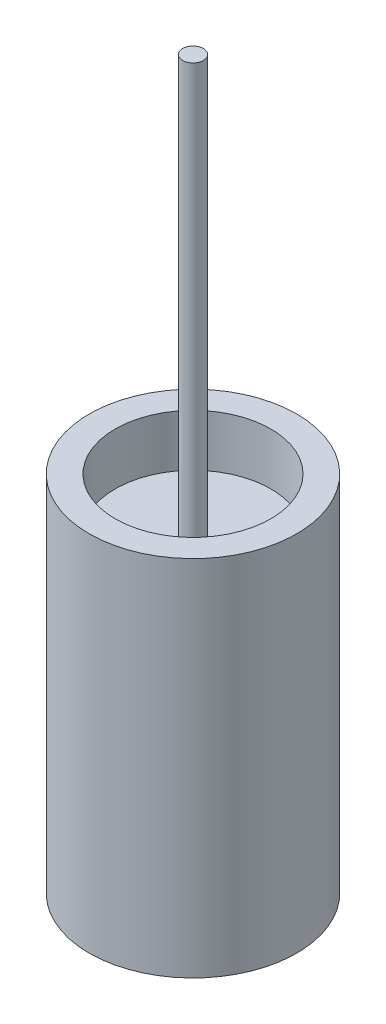
ISO-10303-21;
HEADER;
FILE_DESCRIPTION(('STEP AP214'),'2;1');
FILE_NAME('part.step','',(''),(''),'','','');
FILE_SCHEMA(('AUTOMOTIVE_DESIGN { 1 0 10303 214 1 1 1 1 }'));
ENDSEC;
DATA;
#1=APPLICATION_CONTEXT('core data for automotive mechanical design processes');
#2=APPLICATION_PROTOCOL_DEFINITION('international standard','automotive_design',2000,#1);
#3=PRODUCT_CONTEXT('',#1,'mechanical');
#4=PRODUCT('Part','Part','',(#3));
#5=PRODUCT_RELATED_PRODUCT_CATEGORY('part','',(#4));
#6=PRODUCT_DEFINITION_FORMATION('','',#4);
#7=PRODUCT_DEFINITION_CONTEXT('part definition',#1,'design');
#8=PRODUCT_DEFINITION('design','',#6,#7);
#9=PRODUCT_DEFINITION_SHAPE('','',#8);
#10=(LENGTH_UNIT() NAMED_UNIT(*) SI_UNIT(.MILLI.,.METRE.));
#11=(NAMED_UNIT(*) PLANE_ANGLE_UNIT() SI_UNIT($,.RADIAN.));
#12=(NAMED_UNIT(*) SI_UNIT($,.STERADIAN.) SOLID_ANGLE_UNIT());
#13=UNCERTAINTY_MEASURE_WITH_UNIT(LENGTH_MEASURE(1.E-05),#10,'distance_accuracy_value','');
#14=(GEOMETRIC_REPRESENTATION_CONTEXT(3) GLOBAL_UNCERTAINTY_ASSIGNED_CONTEXT((#13)) GLOBAL_UNIT_ASSIGNED_CONTEXT((#10,
#11,#12)) REPRESENTATION_CONTEXT('',''));
#15=CARTESIAN_POINT('',(0.,0.,0.));
#16=DIRECTION('',(0.,0.,1.));
#17=DIRECTION('',(1.,0.,0.));
#18=AXIS2_PLACEMENT_3D('',#15,#16,#17);
#19=CARTESIAN_POINT('',(0.,35.,0.));
#20=DIRECTION('',(0.,-1.,0.));
#21=DIRECTION('',(0.,0.,-1.));
#22=AXIS2_PLACEMENT_3D('',#19,#20,#21);
#23=CYLINDRICAL_SURFACE('',#22,10.);
#24=CARTESIAN_POINT('',(0.,35.,0.));
#25=DIRECTION('',(0.,1.,0.));
#26=DIRECTION('',(0.,0.,1.));
#27=AXIS2_PLACEMENT_3D('',#24,#25,#26);
#28=CIRCLE('',#27,10.);
#29=CARTESIAN_POINT('',(0.,35.,10.));
#30=VERTEX_POINT('',#29);
#31=EDGE_CURVE('E10',#30,#30,#28,.T.);
#32=ORIENTED_EDGE('',*,*,#31,.F.);
#33=EDGE_LOOP('',(#32));
#34=FACE_BOUND('',#33,.T.);
#35=CARTESIAN_POINT('',(0.,0.,0.));
#36=DIRECTION('',(0.,1.,0.));
#37=DIRECTION('',(0.,0.,1.));
#38=AXIS2_PLACEMENT_3D('',#35,#36,#37);
#39=CIRCLE('',#38,10.);
#40=CARTESIAN_POINT('',(0.,0.,10.));
#41=VERTEX_POINT('',#40);
#42=EDGE_CURVE('E39',#41,#41,#39,.T.);
#43=ORIENTED_EDGE('',*,*,#42,.T.);
#44=EDGE_LOOP('',(#43));
#45=FACE_BOUND('',#44,.T.);
#46=ADVANCED_FACE('F36',(#34,#45),#23,.T.);
#47=CARTESIAN_POINT('',(0.,35.,0.));
#48=DIRECTION('',(0.,1.,0.));
#49=DIRECTION('',(0.,0.,1.));
#50=AXIS2_PLACEMENT_3D('',#47,#48,#49);
#51=PLANE('',#50);
#52=CARTESIAN_POINT('',(0.,35.,0.));
#53=DIRECTION('',(0.,1.,0.));
#54=DIRECTION('',(0.,0.,1.));
#55=AXIS2_PLACEMENT_3D('',#52,#53,#54);
#56=CIRCLE('',#55,7.5);
#57=CARTESIAN_POINT('',(0.,35.,7.5));
#58=VERTEX_POINT('',#57);
#59=EDGE_CURVE('E46',#58,#58,#56,.T.);
#60=ORIENTED_EDGE('',*,*,#59,.F.);
#61=EDGE_LOOP('',(#60));
#62=FACE_BOUND('',#61,.T.);
#63=ORIENTED_EDGE('',*,*,#31,.T.);
#64=EDGE_LOOP('',(#63));
#65=FACE_BOUND('',#64,.T.);
#66=ADVANCED_FACE('F82',(#62,#65),#51,.T.);
#67=CARTESIAN_POINT('',(0.,0.,0.));
#68=DIRECTION('',(0.,1.,0.));
#69=DIRECTION('',(0.,0.,1.));
#70=AXIS2_PLACEMENT_3D('',#67,#68,#69);
#71=PLANE('',#70);
#72=ORIENTED_EDGE('',*,*,#42,.F.);
#73=EDGE_LOOP('',(#72));
#74=FACE_BOUND('',#73,.T.);
#75=ADVANCED_FACE('F76',(#74),#71,.F.);
#76=CARTESIAN_POINT('',(0.,35.,0.));
#77=DIRECTION('',(0.,-1.,0.));
#78=DIRECTION('',(0.,0.,-1.));
#79=AXIS2_PLACEMENT_3D('',#76,#77,#78);
#80=CYLINDRICAL_SURFACE('',#79,7.5);
#81=ORIENTED_EDGE('',*,*,#59,.T.);
#82=EDGE_LOOP('',(#81));
#83=FACE_BOUND('',#82,.T.);
#84=CARTESIAN_POINT('',(0.,30.,0.));
#85=DIRECTION('',(0.,1.,0.));
#86=DIRECTION('',(0.,0.,1.));
#87=AXIS2_PLACEMENT_3D('',#84,#85,#86);
#88=CIRCLE('',#87,7.5);
#89=CARTESIAN_POINT('',(0.,30.,7.5));
#90=VERTEX_POINT('',#89);
#91=EDGE_CURVE('E50',#90,#90,#88,.T.);
#92=ORIENTED_EDGE('',*,*,#91,.F.);
#93=EDGE_LOOP('',(#92));
#94=FACE_BOUND('',#93,.T.);
#95=ADVANCED_FACE('F71',(#83,#94),#80,.F.);
#96=CARTESIAN_POINT('',(0.,30.,0.));
#97=DIRECTION('',(0.,1.,0.));
#98=DIRECTION('',(0.,0.,1.));
#99=AXIS2_PLACEMENT_3D('',#96,#97,#98);
#100=PLANE('',#99);
#101=CARTESIAN_POINT('',(0.,30.,0.));
#102=DIRECTION('',(0.,1.,0.));
#103=DIRECTION('',(0.,0.,1.));
#104=AXIS2_PLACEMENT_3D('',#101,#102,#103);
#105=CIRCLE('',#104,1.);
#106=CARTESIAN_POINT('',(0.,30.,1.));
#107=VERTEX_POINT('',#106);
#108=EDGE_CURVE('E54',#107,#107,#105,.T.);
#109=ORIENTED_EDGE('',*,*,#108,.F.);
#110=EDGE_LOOP('',(#109));
#111=FACE_BOUND('',#110,.T.);
#112=ORIENTED_EDGE('',*,*,#91,.T.);
#113=EDGE_LOOP('',(#112));
#114=FACE_BOUND('',#113,.T.);
#115=ADVANCED_FACE('F65',(#111,#114),#100,.T.);
#116=CARTESIAN_POINT('',(0.,70.,0.));
#117=DIRECTION('',(0.,-1.,0.));
#118=DIRECTION('',(0.,0.,-1.));
#119=AXIS2_PLACEMENT_3D('',#116,#117,#118);
#120=CYLINDRICAL_SURFACE('',#119,1.);
#121=CARTESIAN_POINT('',(0.,70.,0.));
#122=DIRECTION('',(0.,1.,0.));
#123=DIRECTION('',(0.,0.,1.));
#124=AXIS2_PLACEMENT_3D('',#121,#122,#123);
#125=CIRCLE('',#124,1.);
#126=CARTESIAN_POINT('',(0.,70.,1.));
#127=VERTEX_POINT('',#126);
#128=EDGE_CURVE('E53',#127,#127,#125,.T.);
#129=ORIENTED_EDGE('',*,*,#128,.F.);
#130=EDGE_LOOP('',(#129));
#131=FACE_BOUND('',#130,.T.);
#132=ORIENTED_EDGE('',*,*,#108,.T.);
#133=EDGE_LOOP('',(#132));
#134=FACE_BOUND('',#133,.T.);
#135=ADVANCED_FACE('F62',(#131,#134),#120,.T.);
#136=CARTESIAN_POINT('',(0.,70.,0.));
#137=DIRECTION('',(0.,1.,0.));
#138=DIRECTION('',(0.,0.,1.));
#139=AXIS2_PLACEMENT_3D('',#136,#137,#138);
#140=PLANE('',#139);
#141=ORIENTED_EDGE('',*,*,#128,.T.);
#142=EDGE_LOOP('',(#141));
#143=FACE_BOUND('',#142,.T.);
#144=ADVANCED_FACE('F60',(#143),#140,.T.);
#145=CLOSED_SHELL('',(#46,#66,#75,#95,#115,#135,#144));
#146=MANIFOLD_SOLID_BREP('B2',#145);
#147=ADVANCED_BREP_SHAPE_REPRESENTATION('',(#18,#146),#14);
#148=SHAPE_DEFINITION_REPRESENTATION(#9,#147);
ENDSEC;
END-ISO-10303-21;
